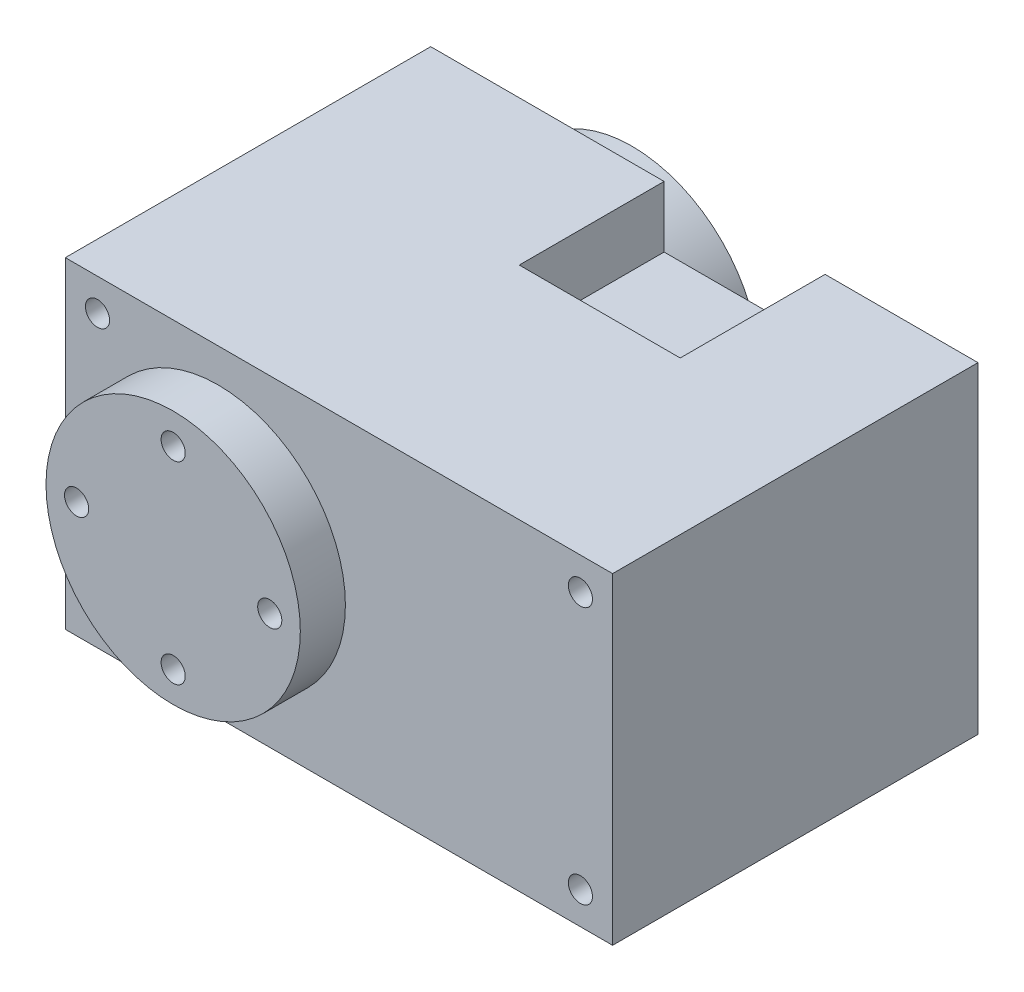
ISO-10303-21;
HEADER;
FILE_DESCRIPTION(('STEP AP214'),'2;1');
FILE_NAME('part.step','',(''),(''),'','','');
FILE_SCHEMA(('AUTOMOTIVE_DESIGN { 1 0 10303 214 1 1 1 1 }'));
ENDSEC;
DATA;
#1=APPLICATION_CONTEXT('core data for automotive mechanical design processes');
#2=APPLICATION_PROTOCOL_DEFINITION('international standard','automotive_design',2000,#1);
#3=PRODUCT_CONTEXT('',#1,'mechanical');
#4=PRODUCT('Part','Part','',(#3));
#5=PRODUCT_RELATED_PRODUCT_CATEGORY('part','',(#4));
#6=PRODUCT_DEFINITION_FORMATION('','',#4);
#7=PRODUCT_DEFINITION_CONTEXT('part definition',#1,'design');
#8=PRODUCT_DEFINITION('design','',#6,#7);
#9=PRODUCT_DEFINITION_SHAPE('','',#8);
#10=(LENGTH_UNIT() NAMED_UNIT(*) SI_UNIT(.MILLI.,.METRE.));
#11=(NAMED_UNIT(*) PLANE_ANGLE_UNIT() SI_UNIT($,.RADIAN.));
#12=(NAMED_UNIT(*) SI_UNIT($,.STERADIAN.) SOLID_ANGLE_UNIT());
#13=UNCERTAINTY_MEASURE_WITH_UNIT(LENGTH_MEASURE(1.E-05),#10,'distance_accuracy_value','');
#14=(GEOMETRIC_REPRESENTATION_CONTEXT(3) GLOBAL_UNCERTAINTY_ASSIGNED_CONTEXT((#13)) GLOBAL_UNIT_ASSIGNED_CONTEXT((#10,
#11,#12)) REPRESENTATION_CONTEXT('',''));
#15=CARTESIAN_POINT('',(0.,0.,0.));
#16=DIRECTION('',(0.,0.,1.));
#17=DIRECTION('',(1.,0.,0.));
#18=AXIS2_PLACEMENT_3D('',#15,#16,#17);
#19=CARTESIAN_POINT('',(0.,0.,19.5));
#20=DIRECTION('',(0.,0.,1.));
#21=DIRECTION('',(1.,0.,0.));
#22=AXIS2_PLACEMENT_3D('',#19,#20,#21);
#23=PLANE('',#22);
#24=CARTESIAN_POINT('',(-7.5,6.,19.5));
#25=DIRECTION('',(0.,0.,1.));
#26=DIRECTION('',(1.,0.,0.));
#27=AXIS2_PLACEMENT_3D('',#24,#25,#26);
#28=CIRCLE('',#27,0.75);
#29=CARTESIAN_POINT('',(-6.75,6.,19.5));
#30=VERTEX_POINT('',#29);
#31=EDGE_CURVE('E20',#30,#30,#28,.T.);
#32=ORIENTED_EDGE('',*,*,#31,.T.);
#33=EDGE_LOOP('',(#32));
#34=FACE_BOUND('',#33,.T.);
#35=ADVANCED_FACE('F17',(#34),#23,.T.);
#36=CARTESIAN_POINT('',(-7.5,7.5,19.5));
#37=DIRECTION('',(0.,0.,1.));
#38=DIRECTION('',(1.,0.,0.));
#39=AXIS2_PLACEMENT_3D('',#36,#37,#38);
#40=PLANE('',#39);
#41=CARTESIAN_POINT('',(-13.5,0.,19.5));
#42=DIRECTION('',(0.,0.,1.));
#43=DIRECTION('',(1.,0.,0.));
#44=AXIS2_PLACEMENT_3D('',#41,#42,#43);
#45=CIRCLE('',#44,0.75);
#46=CARTESIAN_POINT('',(-12.75,0.,19.5));
#47=VERTEX_POINT('',#46);
#48=EDGE_CURVE('E236',#47,#47,#45,.T.);
#49=ORIENTED_EDGE('',*,*,#48,.T.);
#50=EDGE_LOOP('',(#49));
#51=FACE_BOUND('',#50,.T.);
#52=ADVANCED_FACE('F775',(#51),#40,.T.);
#53=CARTESIAN_POINT('',(-15.,0.,19.5));
#54=DIRECTION('',(0.,0.,1.));
#55=DIRECTION('',(1.,0.,0.));
#56=AXIS2_PLACEMENT_3D('',#53,#54,#55);
#57=PLANE('',#56);
#58=CARTESIAN_POINT('',(-7.5,-6.,19.5));
#59=DIRECTION('',(0.,0.,1.));
#60=DIRECTION('',(1.,0.,0.));
#61=AXIS2_PLACEMENT_3D('',#58,#59,#60);
#62=CIRCLE('',#61,0.75);
#63=CARTESIAN_POINT('',(-6.75,-6.,19.5));
#64=VERTEX_POINT('',#63);
#65=EDGE_CURVE('E234',#64,#64,#62,.T.);
#66=ORIENTED_EDGE('',*,*,#65,.T.);
#67=EDGE_LOOP('',(#66));
#68=FACE_BOUND('',#67,.T.);
#69=ADVANCED_FACE('F766',(#68),#57,.T.);
#70=CARTESIAN_POINT('',(-7.5,-7.5,19.5));
#71=DIRECTION('',(0.,0.,1.));
#72=DIRECTION('',(1.,0.,0.));
#73=AXIS2_PLACEMENT_3D('',#70,#71,#72);
#74=PLANE('',#73);
#75=CARTESIAN_POINT('',(-1.5,0.,19.5));
#76=DIRECTION('',(0.,0.,1.));
#77=DIRECTION('',(1.,0.,0.));
#78=AXIS2_PLACEMENT_3D('',#75,#76,#77);
#79=CIRCLE('',#78,0.75);
#80=CARTESIAN_POINT('',(-0.75,0.,19.5));
#81=VERTEX_POINT('',#80);
#82=EDGE_CURVE('E231',#81,#81,#79,.T.);
#83=ORIENTED_EDGE('',*,*,#82,.T.);
#84=EDGE_LOOP('',(#83));
#85=FACE_BOUND('',#84,.T.);
#86=ADVANCED_FACE('F757',(#85),#74,.T.);
#87=CARTESIAN_POINT('',(0.,0.,3.));
#88=DIRECTION('',(0.,0.,-1.));
#89=DIRECTION('',(-1.,0.,0.));
#90=AXIS2_PLACEMENT_3D('',#87,#88,#89);
#91=PLANE('',#90);
#92=CARTESIAN_POINT('',(-13.5,0.,3.));
#93=DIRECTION('',(0.,0.,-1.));
#94=DIRECTION('',(-1.,0.,0.));
#95=AXIS2_PLACEMENT_3D('',#92,#93,#94);
#96=CIRCLE('',#95,0.75);
#97=CARTESIAN_POINT('',(-14.25,0.,3.));
#98=VERTEX_POINT('',#97);
#99=EDGE_CURVE('E228',#98,#98,#96,.T.);
#100=ORIENTED_EDGE('',*,*,#99,.T.);
#101=EDGE_LOOP('',(#100));
#102=FACE_BOUND('',#101,.T.);
#103=ADVANCED_FACE('F748',(#102),#91,.T.);
#104=CARTESIAN_POINT('',(-7.5,-7.5,3.));
#105=DIRECTION('',(0.,0.,-1.));
#106=DIRECTION('',(-1.,0.,0.));
#107=AXIS2_PLACEMENT_3D('',#104,#105,#106);
#108=PLANE('',#107);
#109=CARTESIAN_POINT('',(-7.5,6.,3.));
#110=DIRECTION('',(0.,0.,-1.));
#111=DIRECTION('',(-1.,0.,0.));
#112=AXIS2_PLACEMENT_3D('',#109,#110,#111);
#113=CIRCLE('',#112,0.75);
#114=CARTESIAN_POINT('',(-8.25,6.,3.));
#115=VERTEX_POINT('',#114);
#116=EDGE_CURVE('E225',#115,#115,#113,.T.);
#117=ORIENTED_EDGE('',*,*,#116,.T.);
#118=EDGE_LOOP('',(#117));
#119=FACE_BOUND('',#118,.T.);
#120=ADVANCED_FACE('F739',(#119),#108,.T.);
#121=CARTESIAN_POINT('',(-15.,0.,3.));
#122=DIRECTION('',(0.,0.,-1.));
#123=DIRECTION('',(-1.,0.,0.));
#124=AXIS2_PLACEMENT_3D('',#121,#122,#123);
#125=PLANE('',#124);
#126=CARTESIAN_POINT('',(-1.5,0.,3.));
#127=DIRECTION('',(0.,0.,-1.));
#128=DIRECTION('',(-1.,0.,0.));
#129=AXIS2_PLACEMENT_3D('',#126,#127,#128);
#130=CIRCLE('',#129,0.75);
#131=CARTESIAN_POINT('',(-2.25,0.,3.));
#132=VERTEX_POINT('',#131);
#133=EDGE_CURVE('E222',#132,#132,#130,.T.);
#134=ORIENTED_EDGE('',*,*,#133,.T.);
#135=EDGE_LOOP('',(#134));
#136=FACE_BOUND('',#135,.T.);
#137=ADVANCED_FACE('F730',(#136),#125,.T.);
#138=CARTESIAN_POINT('',(-7.5,7.5,3.));
#139=DIRECTION('',(0.,0.,-1.));
#140=DIRECTION('',(-1.,0.,0.));
#141=AXIS2_PLACEMENT_3D('',#138,#139,#140);
#142=PLANE('',#141);
#143=CARTESIAN_POINT('',(-7.5,-6.,3.));
#144=DIRECTION('',(0.,0.,-1.));
#145=DIRECTION('',(-1.,0.,0.));
#146=AXIS2_PLACEMENT_3D('',#143,#144,#145);
#147=CIRCLE('',#146,0.75);
#148=CARTESIAN_POINT('',(-8.25,-6.,3.));
#149=VERTEX_POINT('',#148);
#150=EDGE_CURVE('E219',#149,#149,#147,.T.);
#151=ORIENTED_EDGE('',*,*,#150,.T.);
#152=EDGE_LOOP('',(#151));
#153=FACE_BOUND('',#152,.T.);
#154=ADVANCED_FACE('F248',(#153),#142,.T.);
#155=CARTESIAN_POINT('',(-7.5,6.,25.5));
#156=DIRECTION('',(0.,0.,1.));
#157=DIRECTION('',(1.,0.,0.));
#158=AXIS2_PLACEMENT_3D('',#155,#156,#157);
#159=CYLINDRICAL_SURFACE('',#158,0.75);
#160=ORIENTED_EDGE('',*,*,#31,.F.);
#161=EDGE_LOOP('',(#160));
#162=FACE_BOUND('',#161,.T.);
#163=CARTESIAN_POINT('',(-7.5,6.,25.5));
#164=DIRECTION('',(0.,0.,1.));
#165=DIRECTION('',(1.,0.,0.));
#166=AXIS2_PLACEMENT_3D('',#163,#164,#165);
#167=CIRCLE('',#166,0.75);
#168=CARTESIAN_POINT('',(-6.75,6.,25.5));
#169=VERTEX_POINT('',#168);
#170=EDGE_CURVE('E216',#169,#169,#167,.F.);
#171=ORIENTED_EDGE('',*,*,#170,.F.);
#172=EDGE_LOOP('',(#171));
#173=FACE_BOUND('',#172,.T.);
#174=ADVANCED_FACE('F244',(#162,#173),#159,.F.);
#175=CARTESIAN_POINT('',(-13.5,0.,25.5));
#176=DIRECTION('',(0.,0.,1.));
#177=DIRECTION('',(1.,0.,0.));
#178=AXIS2_PLACEMENT_3D('',#175,#176,#177);
#179=CYLINDRICAL_SURFACE('',#178,0.75);
#180=ORIENTED_EDGE('',*,*,#48,.F.);
#181=EDGE_LOOP('',(#180));
#182=FACE_BOUND('',#181,.T.);
#183=CARTESIAN_POINT('',(-13.5,0.,25.5));
#184=DIRECTION('',(0.,0.,1.));
#185=DIRECTION('',(1.,0.,0.));
#186=AXIS2_PLACEMENT_3D('',#183,#184,#185);
#187=CIRCLE('',#186,0.75);
#188=CARTESIAN_POINT('',(-12.75,0.,25.5));
#189=VERTEX_POINT('',#188);
#190=EDGE_CURVE('E213',#189,#189,#187,.F.);
#191=ORIENTED_EDGE('',*,*,#190,.F.);
#192=EDGE_LOOP('',(#191));
#193=FACE_BOUND('',#192,.T.);
#194=ADVANCED_FACE('F247',(#182,#193),#179,.F.);
#195=CARTESIAN_POINT('',(-7.5,-6.,25.5));
#196=DIRECTION('',(0.,0.,1.));
#197=DIRECTION('',(1.,0.,0.));
#198=AXIS2_PLACEMENT_3D('',#195,#196,#197);
#199=CYLINDRICAL_SURFACE('',#198,0.75);
#200=ORIENTED_EDGE('',*,*,#65,.F.);
#201=EDGE_LOOP('',(#200));
#202=FACE_BOUND('',#201,.T.);
#203=CARTESIAN_POINT('',(-7.5,-6.,25.5));
#204=DIRECTION('',(0.,0.,1.));
#205=DIRECTION('',(1.,0.,0.));
#206=AXIS2_PLACEMENT_3D('',#203,#204,#205);
#207=CIRCLE('',#206,0.75);
#208=CARTESIAN_POINT('',(-6.75,-6.,25.5));
#209=VERTEX_POINT('',#208);
#210=EDGE_CURVE('E210',#209,#209,#207,.F.);
#211=ORIENTED_EDGE('',*,*,#210,.F.);
#212=EDGE_LOOP('',(#211));
#213=FACE_BOUND('',#212,.T.);
#214=ADVANCED_FACE('F700',(#202,#213),#199,.F.);
#215=CARTESIAN_POINT('',(-1.5,0.,25.5));
#216=DIRECTION('',(0.,0.,1.));
#217=DIRECTION('',(1.,0.,0.));
#218=AXIS2_PLACEMENT_3D('',#215,#216,#217);
#219=CYLINDRICAL_SURFACE('',#218,0.75);
#220=ORIENTED_EDGE('',*,*,#82,.F.);
#221=EDGE_LOOP('',(#220));
#222=FACE_BOUND('',#221,.T.);
#223=CARTESIAN_POINT('',(-1.5,0.,25.5));
#224=DIRECTION('',(0.,0.,1.));
#225=DIRECTION('',(1.,0.,0.));
#226=AXIS2_PLACEMENT_3D('',#223,#224,#225);
#227=CIRCLE('',#226,0.75);
#228=CARTESIAN_POINT('',(-0.75,0.,25.5));
#229=VERTEX_POINT('',#228);
#230=EDGE_CURVE('E207',#229,#229,#227,.F.);
#231=ORIENTED_EDGE('',*,*,#230,.F.);
#232=EDGE_LOOP('',(#231));
#233=FACE_BOUND('',#232,.T.);
#234=ADVANCED_FACE('F691',(#222,#233),#219,.F.);
#235=CARTESIAN_POINT('',(-13.5,0.,-3.));
#236=DIRECTION('',(0.,0.,-1.));
#237=DIRECTION('',(-1.,0.,0.));
#238=AXIS2_PLACEMENT_3D('',#235,#236,#237);
#239=CYLINDRICAL_SURFACE('',#238,0.75);
#240=ORIENTED_EDGE('',*,*,#99,.F.);
#241=EDGE_LOOP('',(#240));
#242=FACE_BOUND('',#241,.T.);
#243=CARTESIAN_POINT('',(-13.5,0.,-3.));
#244=DIRECTION('',(0.,0.,-1.));
#245=DIRECTION('',(-1.,0.,0.));
#246=AXIS2_PLACEMENT_3D('',#243,#244,#245);
#247=CIRCLE('',#246,0.75);
#248=CARTESIAN_POINT('',(-14.25,0.,-3.));
#249=VERTEX_POINT('',#248);
#250=EDGE_CURVE('E204',#249,#249,#247,.F.);
#251=ORIENTED_EDGE('',*,*,#250,.F.);
#252=EDGE_LOOP('',(#251));
#253=FACE_BOUND('',#252,.T.);
#254=ADVANCED_FACE('F682',(#242,#253),#239,.F.);
#255=CARTESIAN_POINT('',(-7.5,6.,-3.));
#256=DIRECTION('',(0.,0.,-1.));
#257=DIRECTION('',(-1.,0.,0.));
#258=AXIS2_PLACEMENT_3D('',#255,#256,#257);
#259=CYLINDRICAL_SURFACE('',#258,0.75);
#260=ORIENTED_EDGE('',*,*,#116,.F.);
#261=EDGE_LOOP('',(#260));
#262=FACE_BOUND('',#261,.T.);
#263=CARTESIAN_POINT('',(-7.5,6.,-3.));
#264=DIRECTION('',(0.,0.,-1.));
#265=DIRECTION('',(-1.,0.,0.));
#266=AXIS2_PLACEMENT_3D('',#263,#264,#265);
#267=CIRCLE('',#266,0.75);
#268=CARTESIAN_POINT('',(-8.25,6.,-3.));
#269=VERTEX_POINT('',#268);
#270=EDGE_CURVE('E201',#269,#269,#267,.F.);
#271=ORIENTED_EDGE('',*,*,#270,.F.);
#272=EDGE_LOOP('',(#271));
#273=FACE_BOUND('',#272,.T.);
#274=ADVANCED_FACE('F673',(#262,#273),#259,.F.);
#275=CARTESIAN_POINT('',(-1.5,0.,-3.));
#276=DIRECTION('',(0.,0.,-1.));
#277=DIRECTION('',(-1.,0.,0.));
#278=AXIS2_PLACEMENT_3D('',#275,#276,#277);
#279=CYLINDRICAL_SURFACE('',#278,0.75);
#280=ORIENTED_EDGE('',*,*,#133,.F.);
#281=EDGE_LOOP('',(#280));
#282=FACE_BOUND('',#281,.T.);
#283=CARTESIAN_POINT('',(-1.5,0.,-3.));
#284=DIRECTION('',(0.,0.,-1.));
#285=DIRECTION('',(-1.,0.,0.));
#286=AXIS2_PLACEMENT_3D('',#283,#284,#285);
#287=CIRCLE('',#286,0.75);
#288=CARTESIAN_POINT('',(-2.25,0.,-3.));
#289=VERTEX_POINT('',#288);
#290=EDGE_CURVE('E198',#289,#289,#287,.F.);
#291=ORIENTED_EDGE('',*,*,#290,.F.);
#292=EDGE_LOOP('',(#291));
#293=FACE_BOUND('',#292,.T.);
#294=ADVANCED_FACE('F664',(#282,#293),#279,.F.);
#295=CARTESIAN_POINT('',(-7.5,-6.,-3.));
#296=DIRECTION('',(0.,0.,-1.));
#297=DIRECTION('',(-1.,0.,0.));
#298=AXIS2_PLACEMENT_3D('',#295,#296,#297);
#299=CYLINDRICAL_SURFACE('',#298,0.75);
#300=ORIENTED_EDGE('',*,*,#150,.F.);
#301=EDGE_LOOP('',(#300));
#302=FACE_BOUND('',#301,.T.);
#303=CARTESIAN_POINT('',(-7.5,-6.,-3.));
#304=DIRECTION('',(0.,0.,-1.));
#305=DIRECTION('',(-1.,0.,0.));
#306=AXIS2_PLACEMENT_3D('',#303,#304,#305);
#307=CIRCLE('',#306,0.75);
#308=CARTESIAN_POINT('',(-8.25,-6.,-3.));
#309=VERTEX_POINT('',#308);
#310=EDGE_CURVE('E195',#309,#309,#307,.F.);
#311=ORIENTED_EDGE('',*,*,#310,.F.);
#312=EDGE_LOOP('',(#311));
#313=FACE_BOUND('',#312,.T.);
#314=ADVANCED_FACE('F256',(#302,#313),#299,.F.);
#315=CARTESIAN_POINT('',(0.,0.,25.5));
#316=DIRECTION('',(0.,0.,1.));
#317=DIRECTION('',(1.,0.,0.));
#318=AXIS2_PLACEMENT_3D('',#315,#316,#317);
#319=PLANE('',#318);
#320=ORIENTED_EDGE('',*,*,#230,.T.);
#321=EDGE_LOOP('',(#320));
#322=FACE_BOUND('',#321,.T.);
#323=ORIENTED_EDGE('',*,*,#210,.T.);
#324=EDGE_LOOP('',(#323));
#325=FACE_BOUND('',#324,.T.);
#326=ORIENTED_EDGE('',*,*,#190,.T.);
#327=EDGE_LOOP('',(#326));
#328=FACE_BOUND('',#327,.T.);
#329=ORIENTED_EDGE('',*,*,#170,.T.);
#330=EDGE_LOOP('',(#329));
#331=FACE_BOUND('',#330,.T.);
#332=CARTESIAN_POINT('',(-7.5,0.,25.5));
#333=DIRECTION('',(0.,0.,1.));
#334=DIRECTION('',(1.,0.,0.));
#335=AXIS2_PLACEMENT_3D('',#332,#333,#334);
#336=CIRCLE('',#335,7.9);
#337=CARTESIAN_POINT('',(0.400000000000001,0.,25.5));
#338=VERTEX_POINT('',#337);
#339=EDGE_CURVE('E192',#338,#338,#336,.F.);
#340=ORIENTED_EDGE('',*,*,#339,.F.);
#341=EDGE_LOOP('',(#340));
#342=FACE_BOUND('',#341,.T.);
#343=ADVANCED_FACE('F252',(#322,#325,#328,#331,#342),#319,.T.);
#344=CARTESIAN_POINT('',(0.,0.,14.7));
#345=DIRECTION('',(0.,0.,1.));
#346=DIRECTION('',(1.,0.,0.));
#347=AXIS2_PLACEMENT_3D('',#344,#345,#346);
#348=PLANE('',#347);
#349=CARTESIAN_POINT('',(-15.,8.,14.7));
#350=DIRECTION('',(0.,0.,1.));
#351=DIRECTION('',(1.,0.,0.));
#352=AXIS2_PLACEMENT_3D('',#349,#350,#351);
#353=CIRCLE('',#352,0.75);
#354=CARTESIAN_POINT('',(-14.25,8.,14.7));
#355=VERTEX_POINT('',#354);
#356=EDGE_CURVE('E189',#355,#355,#353,.T.);
#357=ORIENTED_EDGE('',*,*,#356,.T.);
#358=EDGE_LOOP('',(#357));
#359=FACE_BOUND('',#358,.T.);
#360=ADVANCED_FACE('F255',(#359),#348,.T.);
#361=CARTESIAN_POINT('',(0.,0.,14.7));
#362=DIRECTION('',(0.,0.,1.));
#363=DIRECTION('',(1.,0.,0.));
#364=AXIS2_PLACEMENT_3D('',#361,#362,#363);
#365=PLANE('',#364);
#366=CARTESIAN_POINT('',(-15.,-8.,14.7));
#367=DIRECTION('',(0.,0.,1.));
#368=DIRECTION('',(1.,0.,0.));
#369=AXIS2_PLACEMENT_3D('',#366,#367,#368);
#370=CIRCLE('',#369,0.75);
#371=CARTESIAN_POINT('',(-14.25,-8.,14.7));
#372=VERTEX_POINT('',#371);
#373=EDGE_CURVE('E186',#372,#372,#370,.T.);
#374=ORIENTED_EDGE('',*,*,#373,.T.);
#375=EDGE_LOOP('',(#374));
#376=FACE_BOUND('',#375,.T.);
#377=ADVANCED_FACE('F634',(#376),#365,.T.);
#378=CARTESIAN_POINT('',(0.,0.,14.7));
#379=DIRECTION('',(0.,0.,1.));
#380=DIRECTION('',(1.,0.,0.));
#381=AXIS2_PLACEMENT_3D('',#378,#379,#380);
#382=PLANE('',#381);
#383=CARTESIAN_POINT('',(15.,8.,14.7));
#384=DIRECTION('',(0.,0.,1.));
#385=DIRECTION('',(1.,0.,0.));
#386=AXIS2_PLACEMENT_3D('',#383,#384,#385);
#387=CIRCLE('',#386,0.75);
#388=CARTESIAN_POINT('',(15.75,8.,14.7));
#389=VERTEX_POINT('',#388);
#390=EDGE_CURVE('E183',#389,#389,#387,.T.);
#391=ORIENTED_EDGE('',*,*,#390,.T.);
#392=EDGE_LOOP('',(#391));
#393=FACE_BOUND('',#392,.T.);
#394=ADVANCED_FACE('F625',(#393),#382,.T.);
#395=CARTESIAN_POINT('',(0.,0.,14.7));
#396=DIRECTION('',(0.,0.,1.));
#397=DIRECTION('',(1.,0.,0.));
#398=AXIS2_PLACEMENT_3D('',#395,#396,#397);
#399=PLANE('',#398);
#400=CARTESIAN_POINT('',(15.,-8.,14.7));
#401=DIRECTION('',(0.,0.,1.));
#402=DIRECTION('',(1.,0.,0.));
#403=AXIS2_PLACEMENT_3D('',#400,#401,#402);
#404=CIRCLE('',#403,0.75);
#405=CARTESIAN_POINT('',(15.75,-8.,14.7));
#406=VERTEX_POINT('',#405);
#407=EDGE_CURVE('E113',#406,#406,#404,.T.);
#408=ORIENTED_EDGE('',*,*,#407,.T.);
#409=EDGE_LOOP('',(#408));
#410=FACE_BOUND('',#409,.T.);
#411=ADVANCED_FACE('F617',(#410),#399,.T.);
#412=CARTESIAN_POINT('',(7.5,-10.,9.));
#413=DIRECTION('',(0.,0.,1.));
#414=DIRECTION('',(1.,0.,0.));
#415=AXIS2_PLACEMENT_3D('',#412,#413,#414);
#416=PLANE('',#415);
#417=DIRECTION('',(1.,0.,0.));
#418=VECTOR('',#417,1.);
#419=CARTESIAN_POINT('',(0.,-6.2,9.));
#420=LINE('',#419,#418);
#421=CARTESIAN_POINT('',(7.5,-6.2,9.));
#422=VERTEX_POINT('',#421);
#423=CARTESIAN_POINT('',(-2.5,-6.2,9.));
#424=VERTEX_POINT('',#423);
#425=EDGE_CURVE('E103',#422,#424,#420,.F.);
#426=ORIENTED_EDGE('',*,*,#425,.F.);
#427=DIRECTION('',(0.,1.,0.));
#428=VECTOR('',#427,1.);
#429=CARTESIAN_POINT('',(7.5,-10.,9.));
#430=LINE('',#429,#428);
#431=CARTESIAN_POINT('',(7.5,-10.,9.));
#432=VERTEX_POINT('',#431);
#433=EDGE_CURVE('E351',#422,#432,#430,.F.);
#434=ORIENTED_EDGE('',*,*,#433,.T.);
#435=DIRECTION('',(1.,0.,0.));
#436=VECTOR('',#435,1.);
#437=CARTESIAN_POINT('',(-17.,-10.,9.));
#438=LINE('',#437,#436);
#439=CARTESIAN_POINT('',(-2.5,-10.,9.));
#440=VERTEX_POINT('',#439);
#441=EDGE_CURVE('E110',#440,#432,#438,.T.);
#442=ORIENTED_EDGE('',*,*,#441,.F.);
#443=DIRECTION('',(0.,1.,0.));
#444=VECTOR('',#443,1.);
#445=CARTESIAN_POINT('',(-2.5,-10.,9.));
#446=LINE('',#445,#444);
#447=EDGE_CURVE('E106',#440,#424,#446,.T.);
#448=ORIENTED_EDGE('',*,*,#447,.T.);
#449=EDGE_LOOP('',(#426,#434,#442,#448));
#450=FACE_BOUND('',#449,.T.);
#451=ADVANCED_FACE('F108',(#450),#416,.F.);
#452=CARTESIAN_POINT('',(0.,0.,6.));
#453=DIRECTION('',(0.,0.,-1.));
#454=DIRECTION('',(-1.,0.,0.));
#455=AXIS2_PLACEMENT_3D('',#452,#453,#454);
#456=PLANE('',#455);
#457=CARTESIAN_POINT('',(-15.,8.,6.));
#458=DIRECTION('',(0.,0.,-1.));
#459=DIRECTION('',(-1.,0.,0.));
#460=AXIS2_PLACEMENT_3D('',#457,#458,#459);
#461=CIRCLE('',#460,0.75);
#462=CARTESIAN_POINT('',(-15.75,8.,6.));
#463=VERTEX_POINT('',#462);
#464=EDGE_CURVE('E177',#463,#463,#461,.T.);
#465=ORIENTED_EDGE('',*,*,#464,.T.);
#466=EDGE_LOOP('',(#465));
#467=FACE_BOUND('',#466,.T.);
#468=ADVANCED_FACE('F600',(#467),#456,.T.);
#469=CARTESIAN_POINT('',(0.,0.,6.));
#470=DIRECTION('',(0.,0.,-1.));
#471=DIRECTION('',(-1.,0.,0.));
#472=AXIS2_PLACEMENT_3D('',#469,#470,#471);
#473=PLANE('',#472);
#474=CARTESIAN_POINT('',(15.,8.,6.));
#475=DIRECTION('',(0.,0.,-1.));
#476=DIRECTION('',(-1.,0.,0.));
#477=AXIS2_PLACEMENT_3D('',#474,#475,#476);
#478=CIRCLE('',#477,0.75);
#479=CARTESIAN_POINT('',(14.25,8.,6.));
#480=VERTEX_POINT('',#479);
#481=EDGE_CURVE('E174',#480,#480,#478,.T.);
#482=ORIENTED_EDGE('',*,*,#481,.T.);
#483=EDGE_LOOP('',(#482));
#484=FACE_BOUND('',#483,.T.);
#485=ADVANCED_FACE('F591',(#484),#473,.T.);
#486=CARTESIAN_POINT('',(0.,0.,6.));
#487=DIRECTION('',(0.,0.,-1.));
#488=DIRECTION('',(-1.,0.,0.));
#489=AXIS2_PLACEMENT_3D('',#486,#487,#488);
#490=PLANE('',#489);
#491=CARTESIAN_POINT('',(15.,-8.,6.));
#492=DIRECTION('',(0.,0.,-1.));
#493=DIRECTION('',(-1.,0.,0.));
#494=AXIS2_PLACEMENT_3D('',#491,#492,#493);
#495=CIRCLE('',#494,0.75);
#496=CARTESIAN_POINT('',(14.25,-8.,6.));
#497=VERTEX_POINT('',#496);
#498=EDGE_CURVE('E171',#497,#497,#495,.T.);
#499=ORIENTED_EDGE('',*,*,#498,.T.);
#500=EDGE_LOOP('',(#499));
#501=FACE_BOUND('',#500,.T.);
#502=ADVANCED_FACE('F582',(#501),#490,.T.);
#503=CARTESIAN_POINT('',(0.,0.,-3.));
#504=DIRECTION('',(0.,0.,-1.));
#505=DIRECTION('',(-1.,0.,0.));
#506=AXIS2_PLACEMENT_3D('',#503,#504,#505);
#507=PLANE('',#506);
#508=ORIENTED_EDGE('',*,*,#310,.T.);
#509=EDGE_LOOP('',(#508));
#510=FACE_BOUND('',#509,.T.);
#511=ORIENTED_EDGE('',*,*,#290,.T.);
#512=EDGE_LOOP('',(#511));
#513=FACE_BOUND('',#512,.T.);
#514=ORIENTED_EDGE('',*,*,#270,.T.);
#515=EDGE_LOOP('',(#514));
#516=FACE_BOUND('',#515,.T.);
#517=ORIENTED_EDGE('',*,*,#250,.T.);
#518=EDGE_LOOP('',(#517));
#519=FACE_BOUND('',#518,.T.);
#520=CARTESIAN_POINT('',(-7.5,0.,-3.));
#521=DIRECTION('',(0.,0.,-1.));
#522=DIRECTION('',(-1.,0.,0.));
#523=AXIS2_PLACEMENT_3D('',#520,#521,#522);
#524=CIRCLE('',#523,7.9);
#525=CARTESIAN_POINT('',(-15.4,0.,-3.));
#526=VERTEX_POINT('',#525);
#527=EDGE_CURVE('E168',#526,#526,#524,.F.);
#528=ORIENTED_EDGE('',*,*,#527,.F.);
#529=EDGE_LOOP('',(#528));
#530=FACE_BOUND('',#529,.T.);
#531=ADVANCED_FACE('F573',(#510,#513,#516,#519,#530),#507,.T.);
#532=CARTESIAN_POINT('',(0.,0.,6.));
#533=DIRECTION('',(0.,0.,-1.));
#534=DIRECTION('',(-1.,0.,0.));
#535=AXIS2_PLACEMENT_3D('',#532,#533,#534);
#536=PLANE('',#535);
#537=CARTESIAN_POINT('',(-15.,-8.,6.));
#538=DIRECTION('',(0.,0.,-1.));
#539=DIRECTION('',(-1.,0.,0.));
#540=AXIS2_PLACEMENT_3D('',#537,#538,#539);
#541=CIRCLE('',#540,0.75);
#542=CARTESIAN_POINT('',(-15.75,-8.,6.));
#543=VERTEX_POINT('',#542);
#544=EDGE_CURVE('E164',#543,#543,#541,.T.);
#545=ORIENTED_EDGE('',*,*,#544,.T.);
#546=EDGE_LOOP('',(#545));
#547=FACE_BOUND('',#546,.T.);
#548=ADVANCED_FACE('F265',(#547),#536,.T.);
#549=CARTESIAN_POINT('',(-7.5,0.,22.7));
#550=DIRECTION('',(0.,0.,1.));
#551=DIRECTION('',(1.,0.,0.));
#552=AXIS2_PLACEMENT_3D('',#549,#550,#551);
#553=CYLINDRICAL_SURFACE('',#552,7.9);
#554=ORIENTED_EDGE('',*,*,#339,.T.);
#555=EDGE_LOOP('',(#554));
#556=FACE_BOUND('',#555,.T.);
#557=CARTESIAN_POINT('',(-7.5,0.,22.7));
#558=DIRECTION('',(0.,0.,1.));
#559=DIRECTION('',(1.,0.,0.));
#560=AXIS2_PLACEMENT_3D('',#557,#558,#559);
#561=CIRCLE('',#560,7.9);
#562=CARTESIAN_POINT('',(0.400000000000001,0.,22.7));
#563=VERTEX_POINT('',#562);
#564=EDGE_CURVE('E160',#563,#563,#561,.F.);
#565=ORIENTED_EDGE('',*,*,#564,.F.);
#566=EDGE_LOOP('',(#565));
#567=FACE_BOUND('',#566,.T.);
#568=ADVANCED_FACE('F261',(#556,#567),#553,.T.);
#569=CARTESIAN_POINT('',(-15.,8.,22.7));
#570=DIRECTION('',(0.,0.,1.));
#571=DIRECTION('',(1.,0.,0.));
#572=AXIS2_PLACEMENT_3D('',#569,#570,#571);
#573=CYLINDRICAL_SURFACE('',#572,0.75);
#574=ORIENTED_EDGE('',*,*,#356,.F.);
#575=EDGE_LOOP('',(#574));
#576=FACE_BOUND('',#575,.T.);
#577=CARTESIAN_POINT('',(-15.,8.,22.7));
#578=DIRECTION('',(0.,0.,1.));
#579=DIRECTION('',(1.,0.,0.));
#580=AXIS2_PLACEMENT_3D('',#577,#578,#579);
#581=CIRCLE('',#580,0.75);
#582=CARTESIAN_POINT('',(-14.25,8.,22.7));
#583=VERTEX_POINT('',#582);
#584=EDGE_CURVE('E157',#583,#583,#581,.F.);
#585=ORIENTED_EDGE('',*,*,#584,.F.);
#586=EDGE_LOOP('',(#585));
#587=FACE_BOUND('',#586,.T.);
#588=ADVANCED_FACE('F264',(#576,#587),#573,.F.);
#589=CARTESIAN_POINT('',(-15.,-8.,22.7));
#590=DIRECTION('',(0.,0.,1.));
#591=DIRECTION('',(1.,0.,0.));
#592=AXIS2_PLACEMENT_3D('',#589,#590,#591);
#593=CYLINDRICAL_SURFACE('',#592,0.75);
#594=ORIENTED_EDGE('',*,*,#373,.F.);
#595=EDGE_LOOP('',(#594));
#596=FACE_BOUND('',#595,.T.);
#597=CARTESIAN_POINT('',(-15.,-8.,22.7));
#598=DIRECTION('',(0.,0.,1.));
#599=DIRECTION('',(1.,0.,0.));
#600=AXIS2_PLACEMENT_3D('',#597,#598,#599);
#601=CIRCLE('',#600,0.75);
#602=CARTESIAN_POINT('',(-14.25,-8.,22.7));
#603=VERTEX_POINT('',#602);
#604=EDGE_CURVE('E154',#603,#603,#601,.F.);
#605=ORIENTED_EDGE('',*,*,#604,.F.);
#606=EDGE_LOOP('',(#605));
#607=FACE_BOUND('',#606,.T.);
#608=ADVANCED_FACE('F543',(#596,#607),#593,.F.);
#609=CARTESIAN_POINT('',(15.,8.,22.7));
#610=DIRECTION('',(0.,0.,1.));
#611=DIRECTION('',(1.,0.,0.));
#612=AXIS2_PLACEMENT_3D('',#609,#610,#611);
#613=CYLINDRICAL_SURFACE('',#612,0.75);
#614=ORIENTED_EDGE('',*,*,#390,.F.);
#615=EDGE_LOOP('',(#614));
#616=FACE_BOUND('',#615,.T.);
#617=CARTESIAN_POINT('',(15.,8.,22.7));
#618=DIRECTION('',(0.,0.,1.));
#619=DIRECTION('',(1.,0.,0.));
#620=AXIS2_PLACEMENT_3D('',#617,#618,#619);
#621=CIRCLE('',#620,0.75);
#622=CARTESIAN_POINT('',(15.75,8.,22.7));
#623=VERTEX_POINT('',#622);
#624=EDGE_CURVE('E151',#623,#623,#621,.F.);
#625=ORIENTED_EDGE('',*,*,#624,.F.);
#626=EDGE_LOOP('',(#625));
#627=FACE_BOUND('',#626,.T.);
#628=ADVANCED_FACE('F534',(#616,#627),#613,.F.);
#629=CARTESIAN_POINT('',(15.,-8.,22.7));
#630=DIRECTION('',(0.,0.,1.));
#631=DIRECTION('',(1.,0.,0.));
#632=AXIS2_PLACEMENT_3D('',#629,#630,#631);
#633=CYLINDRICAL_SURFACE('',#632,0.75);
#634=ORIENTED_EDGE('',*,*,#407,.F.);
#635=EDGE_LOOP('',(#634));
#636=FACE_BOUND('',#635,.T.);
#637=CARTESIAN_POINT('',(15.,-8.,22.7));
#638=DIRECTION('',(0.,0.,1.));
#639=DIRECTION('',(1.,0.,0.));
#640=AXIS2_PLACEMENT_3D('',#637,#638,#639);
#641=CIRCLE('',#640,0.75);
#642=CARTESIAN_POINT('',(15.75,-8.,22.7));
#643=VERTEX_POINT('',#642);
#644=EDGE_CURVE('E147',#643,#643,#641,.F.);
#645=ORIENTED_EDGE('',*,*,#644,.F.);
#646=EDGE_LOOP('',(#645));
#647=FACE_BOUND('',#646,.T.);
#648=ADVANCED_FACE('F526',(#636,#647),#633,.F.);
#649=CARTESIAN_POINT('',(-2.5,-10.,9.));
#650=DIRECTION('',(-1.,0.,0.));
#651=DIRECTION('',(0.,0.,1.));
#652=AXIS2_PLACEMENT_3D('',#649,#650,#651);
#653=PLANE('',#652);
#654=ORIENTED_EDGE('',*,*,#447,.F.);
#655=DIRECTION('',(0.,0.,-1.));
#656=VECTOR('',#655,1.);
#657=CARTESIAN_POINT('',(-2.5,-10.,0.));
#658=LINE('',#657,#656);
#659=CARTESIAN_POINT('',(-2.5,-10.,0.));
#660=VERTEX_POINT('',#659);
#661=EDGE_CURVE('E349',#660,#440,#658,.F.);
#662=ORIENTED_EDGE('',*,*,#661,.F.);
#663=DIRECTION('',(0.,1.,0.));
#664=VECTOR('',#663,1.);
#665=CARTESIAN_POINT('',(-2.5,0.,0.));
#666=LINE('',#665,#664);
#667=CARTESIAN_POINT('',(-2.5,-6.2,0.));
#668=VERTEX_POINT('',#667);
#669=EDGE_CURVE('E119',#660,#668,#666,.T.);
#670=ORIENTED_EDGE('',*,*,#669,.T.);
#671=DIRECTION('',(0.,0.,-1.));
#672=VECTOR('',#671,1.);
#673=CARTESIAN_POINT('',(-2.5,-6.2,0.));
#674=LINE('',#673,#672);
#675=EDGE_CURVE('E116',#424,#668,#674,.T.);
#676=ORIENTED_EDGE('',*,*,#675,.F.);
#677=EDGE_LOOP('',(#654,#662,#670,#676));
#678=FACE_BOUND('',#677,.T.);
#679=ADVANCED_FACE('F117',(#678),#653,.F.);
#680=CARTESIAN_POINT('',(0.,-6.2,0.));
#681=DIRECTION('',(0.,-1.,0.));
#682=DIRECTION('',(0.,0.,-1.));
#683=AXIS2_PLACEMENT_3D('',#680,#681,#682);
#684=PLANE('',#683);
#685=ORIENTED_EDGE('',*,*,#675,.T.);
#686=DIRECTION('',(1.,0.,0.));
#687=VECTOR('',#686,1.);
#688=CARTESIAN_POINT('',(0.,-6.2,0.));
#689=LINE('',#688,#687);
#690=CARTESIAN_POINT('',(7.5,-6.2,0.));
#691=VERTEX_POINT('',#690);
#692=EDGE_CURVE('E317',#668,#691,#689,.T.);
#693=ORIENTED_EDGE('',*,*,#692,.T.);
#694=DIRECTION('',(0.,0.,-1.));
#695=VECTOR('',#694,1.);
#696=CARTESIAN_POINT('',(7.5,-6.2,0.));
#697=LINE('',#696,#695);
#698=EDGE_CURVE('E122',#691,#422,#697,.F.);
#699=ORIENTED_EDGE('',*,*,#698,.T.);
#700=ORIENTED_EDGE('',*,*,#425,.T.);
#701=EDGE_LOOP('',(#685,#693,#699,#700));
#702=FACE_BOUND('',#701,.T.);
#703=ADVANCED_FACE('F124',(#702),#684,.T.);
#704=CARTESIAN_POINT('',(7.5,-10.,0.));
#705=DIRECTION('',(1.,0.,0.));
#706=DIRECTION('',(0.,0.,-1.));
#707=AXIS2_PLACEMENT_3D('',#704,#705,#706);
#708=PLANE('',#707);
#709=ORIENTED_EDGE('',*,*,#433,.F.);
#710=ORIENTED_EDGE('',*,*,#698,.F.);
#711=DIRECTION('',(0.,1.,0.));
#712=VECTOR('',#711,1.);
#713=CARTESIAN_POINT('',(7.5,0.,0.));
#714=LINE('',#713,#712);
#715=CARTESIAN_POINT('',(7.5,-10.,0.));
#716=VERTEX_POINT('',#715);
#717=EDGE_CURVE('E315',#691,#716,#714,.F.);
#718=ORIENTED_EDGE('',*,*,#717,.T.);
#719=DIRECTION('',(0.,0.,-1.));
#720=VECTOR('',#719,1.);
#721=CARTESIAN_POINT('',(7.5,-10.,0.));
#722=LINE('',#721,#720);
#723=EDGE_CURVE('E180',#432,#716,#722,.T.);
#724=ORIENTED_EDGE('',*,*,#723,.F.);
#725=EDGE_LOOP('',(#709,#710,#718,#724));
#726=FACE_BOUND('',#725,.T.);
#727=ADVANCED_FACE('F354',(#726),#708,.F.);
#728=CARTESIAN_POINT('',(-17.,-10.,0.));
#729=DIRECTION('',(0.,-1.,0.));
#730=DIRECTION('',(0.,0.,-1.));
#731=AXIS2_PLACEMENT_3D('',#728,#729,#730);
#732=PLANE('',#731);
#733=ORIENTED_EDGE('',*,*,#441,.T.);
#734=ORIENTED_EDGE('',*,*,#723,.T.);
#735=DIRECTION('',(1.,0.,0.));
#736=VECTOR('',#735,1.);
#737=CARTESIAN_POINT('',(0.,-10.,0.));
#738=LINE('',#737,#736);
#739=CARTESIAN_POINT('',(17.,-10.,0.));
#740=VERTEX_POINT('',#739);
#741=EDGE_CURVE('E313',#716,#740,#738,.T.);
#742=ORIENTED_EDGE('',*,*,#741,.T.);
#743=DIRECTION('',(0.,0.,-1.));
#744=VECTOR('',#743,1.);
#745=CARTESIAN_POINT('',(17.,-10.,0.));
#746=LINE('',#745,#744);
#747=CARTESIAN_POINT('',(17.,-10.,22.7));
#748=VERTEX_POINT('',#747);
#749=EDGE_CURVE('E329',#748,#740,#746,.T.);
#750=ORIENTED_EDGE('',*,*,#749,.F.);
#751=DIRECTION('',(1.,0.,0.));
#752=VECTOR('',#751,1.);
#753=CARTESIAN_POINT('',(0.,-10.,22.7));
#754=LINE('',#753,#752);
#755=CARTESIAN_POINT('',(-17.,-10.,22.7));
#756=VERTEX_POINT('',#755);
#757=EDGE_CURVE('E334',#756,#748,#754,.T.);
#758=ORIENTED_EDGE('',*,*,#757,.F.);
#759=DIRECTION('',(0.,0.,1.));
#760=VECTOR('',#759,1.);
#761=CARTESIAN_POINT('',(-17.,-10.,0.));
#762=LINE('',#761,#760);
#763=CARTESIAN_POINT('',(-17.,-10.,0.));
#764=VERTEX_POINT('',#763);
#765=EDGE_CURVE('E336',#764,#756,#762,.T.);
#766=ORIENTED_EDGE('',*,*,#765,.F.);
#767=DIRECTION('',(1.,0.,0.));
#768=VECTOR('',#767,1.);
#769=CARTESIAN_POINT('',(0.,-10.,0.));
#770=LINE('',#769,#768);
#771=EDGE_CURVE('E320',#764,#660,#770,.T.);
#772=ORIENTED_EDGE('',*,*,#771,.T.);
#773=ORIENTED_EDGE('',*,*,#661,.T.);
#774=EDGE_LOOP('',(#733,#734,#742,#750,#758,#766,#772,#773));
#775=FACE_BOUND('',#774,.T.);
#776=ADVANCED_FACE('F358',(#775),#732,.T.);
#777=CARTESIAN_POINT('',(-15.,8.,0.));
#778=DIRECTION('',(0.,0.,-1.));
#779=DIRECTION('',(-1.,0.,0.));
#780=AXIS2_PLACEMENT_3D('',#777,#778,#779);
#781=CYLINDRICAL_SURFACE('',#780,0.75);
#782=ORIENTED_EDGE('',*,*,#464,.F.);
#783=EDGE_LOOP('',(#782));
#784=FACE_BOUND('',#783,.T.);
#785=CARTESIAN_POINT('',(-15.,8.,0.));
#786=DIRECTION('',(0.,0.,-1.));
#787=DIRECTION('',(-1.,0.,0.));
#788=AXIS2_PLACEMENT_3D('',#785,#786,#787);
#789=CIRCLE('',#788,0.75);
#790=CARTESIAN_POINT('',(-15.75,8.,0.));
#791=VERTEX_POINT('',#790);
#792=EDGE_CURVE('E143',#791,#791,#789,.T.);
#793=ORIENTED_EDGE('',*,*,#792,.T.);
#794=EDGE_LOOP('',(#793));
#795=FACE_BOUND('',#794,.T.);
#796=ADVANCED_FACE('F488',(#784,#795),#781,.F.);
#797=CARTESIAN_POINT('',(15.,8.,0.));
#798=DIRECTION('',(0.,0.,-1.));
#799=DIRECTION('',(-1.,0.,0.));
#800=AXIS2_PLACEMENT_3D('',#797,#798,#799);
#801=CYLINDRICAL_SURFACE('',#800,0.75);
#802=ORIENTED_EDGE('',*,*,#481,.F.);
#803=EDGE_LOOP('',(#802));
#804=FACE_BOUND('',#803,.T.);
#805=CARTESIAN_POINT('',(15.,8.,0.));
#806=DIRECTION('',(0.,0.,-1.));
#807=DIRECTION('',(-1.,0.,0.));
#808=AXIS2_PLACEMENT_3D('',#805,#806,#807);
#809=CIRCLE('',#808,0.75);
#810=CARTESIAN_POINT('',(14.25,8.,0.));
#811=VERTEX_POINT('',#810);
#812=EDGE_CURVE('E140',#811,#811,#809,.T.);
#813=ORIENTED_EDGE('',*,*,#812,.T.);
#814=EDGE_LOOP('',(#813));
#815=FACE_BOUND('',#814,.T.);
#816=ADVANCED_FACE('F479',(#804,#815),#801,.F.);
#817=CARTESIAN_POINT('',(15.,-8.,0.));
#818=DIRECTION('',(0.,0.,-1.));
#819=DIRECTION('',(-1.,0.,0.));
#820=AXIS2_PLACEMENT_3D('',#817,#818,#819);
#821=CYLINDRICAL_SURFACE('',#820,0.75);
#822=ORIENTED_EDGE('',*,*,#498,.F.);
#823=EDGE_LOOP('',(#822));
#824=FACE_BOUND('',#823,.T.);
#825=CARTESIAN_POINT('',(15.,-8.,0.));
#826=DIRECTION('',(0.,0.,-1.));
#827=DIRECTION('',(-1.,0.,0.));
#828=AXIS2_PLACEMENT_3D('',#825,#826,#827);
#829=CIRCLE('',#828,0.75);
#830=CARTESIAN_POINT('',(14.25,-8.,0.));
#831=VERTEX_POINT('',#830);
#832=EDGE_CURVE('E137',#831,#831,#829,.T.);
#833=ORIENTED_EDGE('',*,*,#832,.T.);
#834=EDGE_LOOP('',(#833));
#835=FACE_BOUND('',#834,.T.);
#836=ADVANCED_FACE('F470',(#824,#835),#821,.F.);
#837=CARTESIAN_POINT('',(-7.5,0.,0.));
#838=DIRECTION('',(0.,0.,-1.));
#839=DIRECTION('',(-1.,0.,0.));
#840=AXIS2_PLACEMENT_3D('',#837,#838,#839);
#841=CYLINDRICAL_SURFACE('',#840,7.9);
#842=ORIENTED_EDGE('',*,*,#527,.T.);
#843=EDGE_LOOP('',(#842));
#844=FACE_BOUND('',#843,.T.);
#845=CARTESIAN_POINT('',(-7.5,0.,0.));
#846=DIRECTION('',(0.,0.,-1.));
#847=DIRECTION('',(-1.,0.,0.));
#848=AXIS2_PLACEMENT_3D('',#845,#846,#847);
#849=CIRCLE('',#848,7.9);
#850=CARTESIAN_POINT('',(-15.4,0.,0.));
#851=VERTEX_POINT('',#850);
#852=EDGE_CURVE('E134',#851,#851,#849,.T.);
#853=ORIENTED_EDGE('',*,*,#852,.T.);
#854=EDGE_LOOP('',(#853));
#855=FACE_BOUND('',#854,.T.);
#856=ADVANCED_FACE('F461',(#844,#855),#841,.T.);
#857=CARTESIAN_POINT('',(-15.,-8.,0.));
#858=DIRECTION('',(0.,0.,-1.));
#859=DIRECTION('',(-1.,0.,0.));
#860=AXIS2_PLACEMENT_3D('',#857,#858,#859);
#861=CYLINDRICAL_SURFACE('',#860,0.75);
#862=ORIENTED_EDGE('',*,*,#544,.F.);
#863=EDGE_LOOP('',(#862));
#864=FACE_BOUND('',#863,.T.);
#865=CARTESIAN_POINT('',(-15.,-8.,0.));
#866=DIRECTION('',(0.,0.,-1.));
#867=DIRECTION('',(-1.,0.,0.));
#868=AXIS2_PLACEMENT_3D('',#865,#866,#867);
#869=CIRCLE('',#868,0.75);
#870=CARTESIAN_POINT('',(-15.75,-8.,0.));
#871=VERTEX_POINT('',#870);
#872=EDGE_CURVE('E130',#871,#871,#869,.T.);
#873=ORIENTED_EDGE('',*,*,#872,.T.);
#874=EDGE_LOOP('',(#873));
#875=FACE_BOUND('',#874,.T.);
#876=ADVANCED_FACE('F452',(#864,#875),#861,.F.);
#877=CARTESIAN_POINT('',(0.,6.2,0.));
#878=DIRECTION('',(0.,-1.,0.));
#879=DIRECTION('',(0.,0.,-1.));
#880=AXIS2_PLACEMENT_3D('',#877,#878,#879);
#881=PLANE('',#880);
#882=DIRECTION('',(0.,0.,-1.));
#883=VECTOR('',#882,1.);
#884=CARTESIAN_POINT('',(-2.5,6.2,9.));
#885=LINE('',#884,#883);
#886=CARTESIAN_POINT('',(-2.5,6.2,9.));
#887=VERTEX_POINT('',#886);
#888=CARTESIAN_POINT('',(-2.5,6.2,0.));
#889=VERTEX_POINT('',#888);
#890=EDGE_CURVE('E339',#887,#889,#885,.T.);
#891=ORIENTED_EDGE('',*,*,#890,.F.);
#892=DIRECTION('',(-1.,0.,0.));
#893=VECTOR('',#892,1.);
#894=CARTESIAN_POINT('',(7.5,6.2,9.));
#895=LINE('',#894,#893);
#896=CARTESIAN_POINT('',(7.5,6.2,9.));
#897=VERTEX_POINT('',#896);
#898=EDGE_CURVE('E167',#897,#887,#895,.T.);
#899=ORIENTED_EDGE('',*,*,#898,.F.);
#900=DIRECTION('',(0.,0.,1.));
#901=VECTOR('',#900,1.);
#902=CARTESIAN_POINT('',(7.5,6.2,0.));
#903=LINE('',#902,#901);
#904=CARTESIAN_POINT('',(7.5,6.2,0.));
#905=VERTEX_POINT('',#904);
#906=EDGE_CURVE('E306',#905,#897,#903,.T.);
#907=ORIENTED_EDGE('',*,*,#906,.F.);
#908=DIRECTION('',(1.,0.,0.));
#909=VECTOR('',#908,1.);
#910=CARTESIAN_POINT('',(0.,6.2,0.));
#911=LINE('',#910,#909);
#912=EDGE_CURVE('E327',#905,#889,#911,.F.);
#913=ORIENTED_EDGE('',*,*,#912,.T.);
#914=EDGE_LOOP('',(#891,#899,#907,#913));
#915=FACE_BOUND('',#914,.T.);
#916=ADVANCED_FACE('F444',(#915),#881,.F.);
#917=CARTESIAN_POINT('',(7.5,10.,9.));
#918=DIRECTION('',(0.,0.,-1.));
#919=DIRECTION('',(-1.,0.,0.));
#920=AXIS2_PLACEMENT_3D('',#917,#918,#919);
#921=PLANE('',#920);
#922=DIRECTION('',(1.,0.,0.));
#923=VECTOR('',#922,1.);
#924=CARTESIAN_POINT('',(17.,10.,9.));
#925=LINE('',#924,#923);
#926=CARTESIAN_POINT('',(7.5,10.,9.));
#927=VERTEX_POINT('',#926);
#928=CARTESIAN_POINT('',(-2.5,10.,9.));
#929=VERTEX_POINT('',#928);
#930=EDGE_CURVE('E303',#927,#929,#925,.F.);
#931=ORIENTED_EDGE('',*,*,#930,.F.);
#932=DIRECTION('',(0.,1.,0.));
#933=VECTOR('',#932,1.);
#934=CARTESIAN_POINT('',(7.5,10.,9.));
#935=LINE('',#934,#933);
#936=EDGE_CURVE('E133',#897,#927,#935,.T.);
#937=ORIENTED_EDGE('',*,*,#936,.F.);
#938=ORIENTED_EDGE('',*,*,#898,.T.);
#939=DIRECTION('',(0.,1.,0.));
#940=VECTOR('',#939,1.);
#941=CARTESIAN_POINT('',(-2.5,10.,9.));
#942=LINE('',#941,#940);
#943=EDGE_CURVE('E342',#929,#887,#942,.F.);
#944=ORIENTED_EDGE('',*,*,#943,.F.);
#945=EDGE_LOOP('',(#931,#937,#938,#944));
#946=FACE_BOUND('',#945,.T.);
#947=ADVANCED_FACE('F370',(#946),#921,.T.);
#948=CARTESIAN_POINT('',(-2.5,10.,9.));
#949=DIRECTION('',(1.,0.,0.));
#950=DIRECTION('',(0.,0.,-1.));
#951=AXIS2_PLACEMENT_3D('',#948,#949,#950);
#952=PLANE('',#951);
#953=ORIENTED_EDGE('',*,*,#943,.T.);
#954=ORIENTED_EDGE('',*,*,#890,.T.);
#955=DIRECTION('',(0.,1.,0.));
#956=VECTOR('',#955,1.);
#957=CARTESIAN_POINT('',(-2.5,0.,0.));
#958=LINE('',#957,#956);
#959=CARTESIAN_POINT('',(-2.5,10.,0.));
#960=VERTEX_POINT('',#959);
#961=EDGE_CURVE('E325',#889,#960,#958,.T.);
#962=ORIENTED_EDGE('',*,*,#961,.T.);
#963=DIRECTION('',(0.,0.,1.));
#964=VECTOR('',#963,1.);
#965=CARTESIAN_POINT('',(-2.5,10.,0.));
#966=LINE('',#965,#964);
#967=EDGE_CURVE('E298',#929,#960,#966,.F.);
#968=ORIENTED_EDGE('',*,*,#967,.F.);
#969=EDGE_LOOP('',(#953,#954,#962,#968));
#970=FACE_BOUND('',#969,.T.);
#971=ADVANCED_FACE('F374',(#970),#952,.T.);
#972=CARTESIAN_POINT('',(-17.,10.,0.));
#973=DIRECTION('',(-1.,0.,0.));
#974=DIRECTION('',(0.,0.,1.));
#975=AXIS2_PLACEMENT_3D('',#972,#973,#974);
#976=PLANE('',#975);
#977=DIRECTION('',(0.,0.,1.));
#978=VECTOR('',#977,1.);
#979=CARTESIAN_POINT('',(-17.,10.,0.));
#980=LINE('',#979,#978);
#981=CARTESIAN_POINT('',(-17.,10.,0.));
#982=VERTEX_POINT('',#981);
#983=CARTESIAN_POINT('',(-17.,10.,22.7));
#984=VERTEX_POINT('',#983);
#985=EDGE_CURVE('E286',#982,#984,#980,.T.);
#986=ORIENTED_EDGE('',*,*,#985,.F.);
#987=DIRECTION('',(0.,1.,0.));
#988=VECTOR('',#987,1.);
#989=CARTESIAN_POINT('',(-17.,0.,0.));
#990=LINE('',#989,#988);
#991=EDGE_CURVE('E323',#982,#764,#990,.F.);
#992=ORIENTED_EDGE('',*,*,#991,.T.);
#993=ORIENTED_EDGE('',*,*,#765,.T.);
#994=DIRECTION('',(0.,1.,0.));
#995=VECTOR('',#994,1.);
#996=CARTESIAN_POINT('',(-17.,0.,22.7));
#997=LINE('',#996,#995);
#998=EDGE_CURVE('E163',#984,#756,#997,.F.);
#999=ORIENTED_EDGE('',*,*,#998,.F.);
#1000=EDGE_LOOP('',(#986,#992,#993,#999));
#1001=FACE_BOUND('',#1000,.T.);
#1002=ADVANCED_FACE('F273',(#1001),#976,.T.);
#1003=CARTESIAN_POINT('',(0.,0.,22.7));
#1004=DIRECTION('',(0.,0.,1.));
#1005=DIRECTION('',(1.,0.,0.));
#1006=AXIS2_PLACEMENT_3D('',#1003,#1004,#1005);
#1007=PLANE('',#1006);
#1008=ORIENTED_EDGE('',*,*,#644,.T.);
#1009=EDGE_LOOP('',(#1008));
#1010=FACE_BOUND('',#1009,.T.);
#1011=ORIENTED_EDGE('',*,*,#624,.T.);
#1012=EDGE_LOOP('',(#1011));
#1013=FACE_BOUND('',#1012,.T.);
#1014=ORIENTED_EDGE('',*,*,#604,.T.);
#1015=EDGE_LOOP('',(#1014));
#1016=FACE_BOUND('',#1015,.T.);
#1017=ORIENTED_EDGE('',*,*,#584,.T.);
#1018=EDGE_LOOP('',(#1017));
#1019=FACE_BOUND('',#1018,.T.);
#1020=ORIENTED_EDGE('',*,*,#564,.T.);
#1021=EDGE_LOOP('',(#1020));
#1022=FACE_BOUND('',#1021,.T.);
#1023=DIRECTION('',(1.,0.,0.));
#1024=VECTOR('',#1023,1.);
#1025=CARTESIAN_POINT('',(17.,10.,22.7));
#1026=LINE('',#1025,#1024);
#1027=CARTESIAN_POINT('',(17.,10.,22.7));
#1028=VERTEX_POINT('',#1027);
#1029=EDGE_CURVE('E279',#984,#1028,#1026,.T.);
#1030=ORIENTED_EDGE('',*,*,#1029,.F.);
#1031=ORIENTED_EDGE('',*,*,#998,.T.);
#1032=ORIENTED_EDGE('',*,*,#757,.T.);
#1033=DIRECTION('',(0.,1.,0.));
#1034=VECTOR('',#1033,1.);
#1035=CARTESIAN_POINT('',(17.,-10.,22.7));
#1036=LINE('',#1035,#1034);
#1037=EDGE_CURVE('E150',#1028,#748,#1036,.F.);
#1038=ORIENTED_EDGE('',*,*,#1037,.F.);
#1039=EDGE_LOOP('',(#1030,#1031,#1032,#1038));
#1040=FACE_BOUND('',#1039,.T.);
#1041=ADVANCED_FACE('F269',(#1010,#1013,#1016,#1019,#1022,#1040),#1007,.T.);
#1042=CARTESIAN_POINT('',(17.,-10.,0.));
#1043=DIRECTION('',(1.,0.,0.));
#1044=DIRECTION('',(0.,0.,-1.));
#1045=AXIS2_PLACEMENT_3D('',#1042,#1043,#1044);
#1046=PLANE('',#1045);
#1047=ORIENTED_EDGE('',*,*,#749,.T.);
#1048=DIRECTION('',(0.,1.,0.));
#1049=VECTOR('',#1048,1.);
#1050=CARTESIAN_POINT('',(17.,0.,0.));
#1051=LINE('',#1050,#1049);
#1052=CARTESIAN_POINT('',(17.,10.,0.));
#1053=VERTEX_POINT('',#1052);
#1054=EDGE_CURVE('E146',#740,#1053,#1051,.T.);
#1055=ORIENTED_EDGE('',*,*,#1054,.T.);
#1056=DIRECTION('',(0.,0.,1.));
#1057=VECTOR('',#1056,1.);
#1058=CARTESIAN_POINT('',(17.,10.,0.));
#1059=LINE('',#1058,#1057);
#1060=EDGE_CURVE('E285',#1028,#1053,#1059,.F.);
#1061=ORIENTED_EDGE('',*,*,#1060,.F.);
#1062=ORIENTED_EDGE('',*,*,#1037,.T.);
#1063=EDGE_LOOP('',(#1047,#1055,#1061,#1062));
#1064=FACE_BOUND('',#1063,.T.);
#1065=ADVANCED_FACE('F272',(#1064),#1046,.T.);
#1066=CARTESIAN_POINT('',(0.,0.,0.));
#1067=DIRECTION('',(0.,0.,1.));
#1068=DIRECTION('',(1.,0.,0.));
#1069=AXIS2_PLACEMENT_3D('',#1066,#1067,#1068);
#1070=PLANE('',#1069);
#1071=ORIENTED_EDGE('',*,*,#872,.F.);
#1072=EDGE_LOOP('',(#1071));
#1073=FACE_BOUND('',#1072,.T.);
#1074=ORIENTED_EDGE('',*,*,#852,.F.);
#1075=EDGE_LOOP('',(#1074));
#1076=FACE_BOUND('',#1075,.T.);
#1077=ORIENTED_EDGE('',*,*,#832,.F.);
#1078=EDGE_LOOP('',(#1077));
#1079=FACE_BOUND('',#1078,.T.);
#1080=ORIENTED_EDGE('',*,*,#812,.F.);
#1081=EDGE_LOOP('',(#1080));
#1082=FACE_BOUND('',#1081,.T.);
#1083=ORIENTED_EDGE('',*,*,#792,.F.);
#1084=EDGE_LOOP('',(#1083));
#1085=FACE_BOUND('',#1084,.T.);
#1086=DIRECTION('',(1.,0.,0.));
#1087=VECTOR('',#1086,1.);
#1088=CARTESIAN_POINT('',(17.,10.,0.));
#1089=LINE('',#1088,#1087);
#1090=CARTESIAN_POINT('',(7.5,10.,0.));
#1091=VERTEX_POINT('',#1090);
#1092=EDGE_CURVE('E26',#1053,#1091,#1089,.F.);
#1093=ORIENTED_EDGE('',*,*,#1092,.F.);
#1094=ORIENTED_EDGE('',*,*,#1054,.F.);
#1095=ORIENTED_EDGE('',*,*,#741,.F.);
#1096=ORIENTED_EDGE('',*,*,#717,.F.);
#1097=ORIENTED_EDGE('',*,*,#692,.F.);
#1098=ORIENTED_EDGE('',*,*,#669,.F.);
#1099=ORIENTED_EDGE('',*,*,#771,.F.);
#1100=ORIENTED_EDGE('',*,*,#991,.F.);
#1101=DIRECTION('',(1.,0.,0.));
#1102=VECTOR('',#1101,1.);
#1103=CARTESIAN_POINT('',(17.,10.,0.));
#1104=LINE('',#1103,#1102);
#1105=EDGE_CURVE('E294',#960,#982,#1104,.F.);
#1106=ORIENTED_EDGE('',*,*,#1105,.F.);
#1107=ORIENTED_EDGE('',*,*,#961,.F.);
#1108=ORIENTED_EDGE('',*,*,#912,.F.);
#1109=DIRECTION('',(0.,1.,0.));
#1110=VECTOR('',#1109,1.);
#1111=CARTESIAN_POINT('',(7.5,10.,0.));
#1112=LINE('',#1111,#1110);
#1113=EDGE_CURVE('E35',#1091,#905,#1112,.F.);
#1114=ORIENTED_EDGE('',*,*,#1113,.F.);
#1115=EDGE_LOOP('',(#1093,#1094,#1095,#1096,#1097,#1098,#1099,#1100,#1106,#1107,#1108,#1114));
#1116=FACE_BOUND('',#1115,.T.);
#1117=ADVANCED_FACE('F360',(#1073,#1076,#1079,#1082,#1085,#1116),#1070,.F.);
#1118=CARTESIAN_POINT('',(7.5,10.,0.));
#1119=DIRECTION('',(-1.,0.,0.));
#1120=DIRECTION('',(0.,0.,1.));
#1121=AXIS2_PLACEMENT_3D('',#1118,#1119,#1120);
#1122=PLANE('',#1121);
#1123=ORIENTED_EDGE('',*,*,#1113,.T.);
#1124=ORIENTED_EDGE('',*,*,#906,.T.);
#1125=ORIENTED_EDGE('',*,*,#936,.T.);
#1126=DIRECTION('',(0.,0.,1.));
#1127=VECTOR('',#1126,1.);
#1128=CARTESIAN_POINT('',(7.5,10.,0.));
#1129=LINE('',#1128,#1127);
#1130=EDGE_CURVE('E11',#1091,#927,#1129,.T.);
#1131=ORIENTED_EDGE('',*,*,#1130,.F.);
#1132=EDGE_LOOP('',(#1123,#1124,#1125,#1131));
#1133=FACE_BOUND('',#1132,.T.);
#1134=ADVANCED_FACE('F366',(#1133),#1122,.T.);
#1135=CARTESIAN_POINT('',(17.,10.,0.));
#1136=DIRECTION('',(0.,1.,0.));
#1137=DIRECTION('',(0.,0.,1.));
#1138=AXIS2_PLACEMENT_3D('',#1135,#1136,#1137);
#1139=PLANE('',#1138);
#1140=ORIENTED_EDGE('',*,*,#1092,.T.);
#1141=ORIENTED_EDGE('',*,*,#1130,.T.);
#1142=ORIENTED_EDGE('',*,*,#930,.T.);
#1143=ORIENTED_EDGE('',*,*,#967,.T.);
#1144=ORIENTED_EDGE('',*,*,#1105,.T.);
#1145=ORIENTED_EDGE('',*,*,#985,.T.);
#1146=ORIENTED_EDGE('',*,*,#1029,.T.);
#1147=ORIENTED_EDGE('',*,*,#1060,.T.);
#1148=EDGE_LOOP('',(#1140,#1141,#1142,#1143,#1144,#1145,#1146,#1147));
#1149=FACE_BOUND('',#1148,.T.);
#1150=ADVANCED_FACE('F291',(#1149),#1139,.T.);
#1151=CLOSED_SHELL('',(#35,#52,#69,#86,#103,#120,#137,#154,#174,#194,#214,#234,#254,#274,#294,
#314,#343,#360,#377,#394,#411,#451,#468,#485,#502,#531,#548,#568,#588,#608,#628,#648,#679,#703,
#727,#776,#796,#816,#836,#856,#876,#916,#947,#971,#1002,#1041,#1065,#1117,#1134,#1150));
#1152=MANIFOLD_SOLID_BREP('B1',#1151);
#1153=ADVANCED_BREP_SHAPE_REPRESENTATION('',(#18,#1152),#14);
#1154=SHAPE_DEFINITION_REPRESENTATION(#9,#1153);
ENDSEC;
END-ISO-10303-21;
